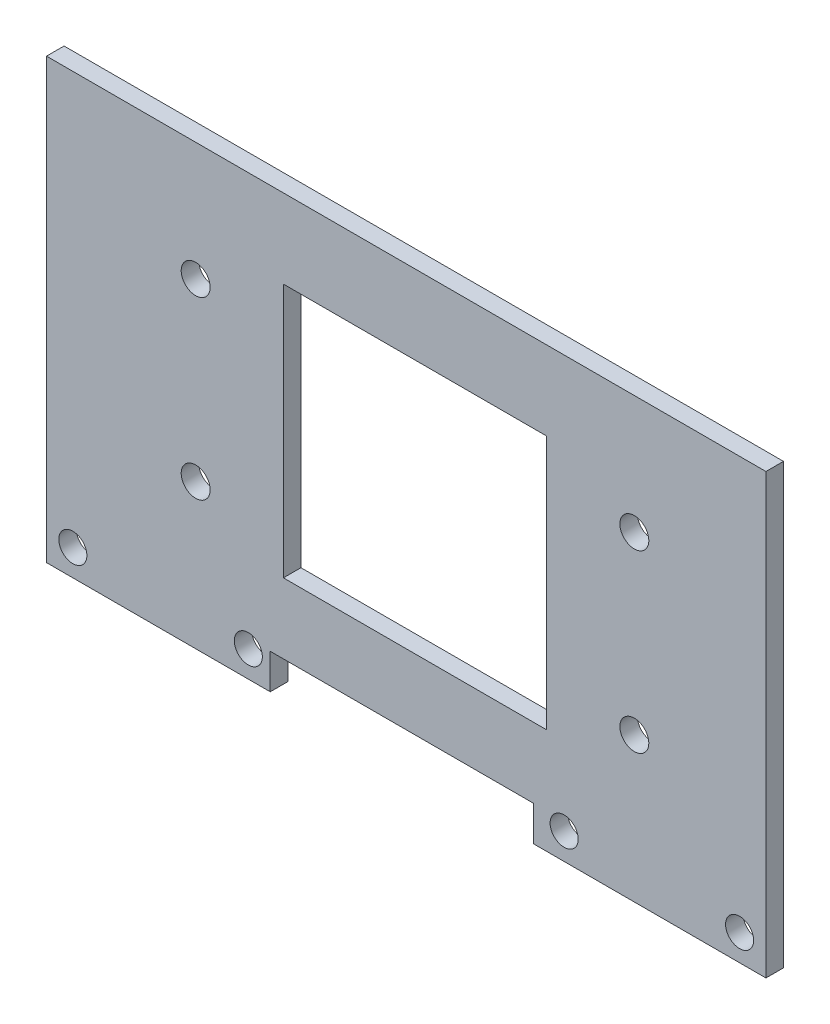
ISO-10303-21;
HEADER;
FILE_DESCRIPTION(('STEP AP214'),'2;1');
FILE_NAME('part.step','',(''),(''),'','','');
FILE_SCHEMA(('AUTOMOTIVE_DESIGN { 1 0 10303 214 1 1 1 1 }'));
ENDSEC;
DATA;
#1=APPLICATION_CONTEXT('core data for automotive mechanical design processes');
#2=APPLICATION_PROTOCOL_DEFINITION('international standard','automotive_design',2000,#1);
#3=PRODUCT_CONTEXT('',#1,'mechanical');
#4=PRODUCT('Part','Part','',(#3));
#5=PRODUCT_RELATED_PRODUCT_CATEGORY('part','',(#4));
#6=PRODUCT_DEFINITION_FORMATION('','',#4);
#7=PRODUCT_DEFINITION_CONTEXT('part definition',#1,'design');
#8=PRODUCT_DEFINITION('design','',#6,#7);
#9=PRODUCT_DEFINITION_SHAPE('','',#8);
#10=(LENGTH_UNIT() NAMED_UNIT(*) SI_UNIT(.MILLI.,.METRE.));
#11=(NAMED_UNIT(*) PLANE_ANGLE_UNIT() SI_UNIT($,.RADIAN.));
#12=(NAMED_UNIT(*) SI_UNIT($,.STERADIAN.) SOLID_ANGLE_UNIT());
#13=UNCERTAINTY_MEASURE_WITH_UNIT(LENGTH_MEASURE(1.E-05),#10,'distance_accuracy_value','');
#14=(GEOMETRIC_REPRESENTATION_CONTEXT(3) GLOBAL_UNCERTAINTY_ASSIGNED_CONTEXT((#13)) GLOBAL_UNIT_ASSIGNED_CONTEXT((#10,
#11,#12)) REPRESENTATION_CONTEXT('',''));
#15=CARTESIAN_POINT('',(0.,0.,0.));
#16=DIRECTION('',(0.,0.,1.));
#17=DIRECTION('',(1.,0.,0.));
#18=AXIS2_PLACEMENT_3D('',#15,#16,#17);
#19=CARTESIAN_POINT('',(-40.,-25.,2.));
#20=DIRECTION('',(0.,1.,0.));
#21=DIRECTION('',(-1.,0.,0.));
#22=AXIS2_PLACEMENT_3D('',#19,#20,#21);
#23=PLANE('',#22);
#24=DIRECTION('',(1.,0.,0.));
#25=VECTOR('',#24,1.);
#26=CARTESIAN_POINT('',(-40.,-25.,0.));
#27=LINE('',#26,#25);
#28=CARTESIAN_POINT('',(-42.,-25.,0.));
#29=VERTEX_POINT('',#28);
#30=CARTESIAN_POINT('',(-16.5,-25.,0.));
#31=VERTEX_POINT('',#30);
#32=EDGE_CURVE('E142',#29,#31,#27,.T.);
#33=ORIENTED_EDGE('',*,*,#32,.T.);
#34=DIRECTION('',(0.,0.,1.));
#35=VECTOR('',#34,1.);
#36=CARTESIAN_POINT('',(-16.5,-25.,0.));
#37=LINE('',#36,#35);
#38=CARTESIAN_POINT('',(-16.5,-25.,2.));
#39=VERTEX_POINT('',#38);
#40=EDGE_CURVE('E195',#31,#39,#37,.T.);
#41=ORIENTED_EDGE('',*,*,#40,.T.);
#42=DIRECTION('',(1.,0.,0.));
#43=VECTOR('',#42,1.);
#44=CARTESIAN_POINT('',(-40.,-25.,2.));
#45=LINE('',#44,#43);
#46=CARTESIAN_POINT('',(-42.,-25.,2.));
#47=VERTEX_POINT('',#46);
#48=EDGE_CURVE('E174',#47,#39,#45,.T.);
#49=ORIENTED_EDGE('',*,*,#48,.F.);
#50=DIRECTION('',(0.,0.,1.));
#51=VECTOR('',#50,1.);
#52=CARTESIAN_POINT('',(-42.,-25.,0.));
#53=LINE('',#52,#51);
#54=EDGE_CURVE('E240',#29,#47,#53,.T.);
#55=ORIENTED_EDGE('',*,*,#54,.F.);
#56=EDGE_LOOP('',(#33,#41,#49,#55));
#57=FACE_BOUND('',#56,.T.);
#58=ADVANCED_FACE('F44',(#57),#23,.F.);
#59=CARTESIAN_POINT('',(0.,0.,2.));
#60=DIRECTION('',(0.,0.,1.));
#61=DIRECTION('',(1.,0.,0.));
#62=AXIS2_PLACEMENT_3D('',#59,#60,#61);
#63=PLANE('',#62);
#64=CARTESIAN_POINT('',(25.,11.5,2.));
#65=DIRECTION('',(0.,0.,1.));
#66=DIRECTION('',(-1.,0.,0.));
#67=AXIS2_PLACEMENT_3D('',#64,#65,#66);
#68=CIRCLE('',#67,1.65);
#69=CARTESIAN_POINT('',(23.35,11.5,2.));
#70=VERTEX_POINT('',#69);
#71=EDGE_CURVE('E567',#70,#70,#68,.T.);
#72=ORIENTED_EDGE('',*,*,#71,.F.);
#73=EDGE_LOOP('',(#72));
#74=FACE_BOUND('',#73,.T.);
#75=CARTESIAN_POINT('',(-25.,-8.5,2.));
#76=DIRECTION('',(0.,0.,1.));
#77=DIRECTION('',(-1.,0.,0.));
#78=AXIS2_PLACEMENT_3D('',#75,#76,#77);
#79=CIRCLE('',#78,1.65);
#80=CARTESIAN_POINT('',(-26.65,-8.5,2.));
#81=VERTEX_POINT('',#80);
#82=EDGE_CURVE('E570',#81,#81,#79,.T.);
#83=ORIENTED_EDGE('',*,*,#82,.F.);
#84=EDGE_LOOP('',(#83));
#85=FACE_BOUND('',#84,.T.);
#86=CARTESIAN_POINT('',(25.,-8.49999999999999,2.));
#87=DIRECTION('',(0.,0.,1.));
#88=DIRECTION('',(1.,0.,0.));
#89=AXIS2_PLACEMENT_3D('',#86,#87,#88);
#90=CIRCLE('',#89,1.65);
#91=CARTESIAN_POINT('',(26.65,-8.49999999999999,2.));
#92=VERTEX_POINT('',#91);
#93=EDGE_CURVE('E585',#92,#92,#90,.T.);
#94=ORIENTED_EDGE('',*,*,#93,.F.);
#95=EDGE_LOOP('',(#94));
#96=FACE_BOUND('',#95,.T.);
#97=CARTESIAN_POINT('',(-25.,11.5,2.));
#98=DIRECTION('',(0.,0.,1.));
#99=DIRECTION('',(1.,0.,0.));
#100=AXIS2_PLACEMENT_3D('',#97,#98,#99);
#101=CIRCLE('',#100,1.65);
#102=CARTESIAN_POINT('',(-23.35,11.5,2.));
#103=VERTEX_POINT('',#102);
#104=EDGE_CURVE('E161',#103,#103,#101,.T.);
#105=ORIENTED_EDGE('',*,*,#104,.F.);
#106=EDGE_LOOP('',(#105));
#107=FACE_BOUND('',#106,.T.);
#108=DIRECTION('',(-1.,0.,0.));
#109=VECTOR('',#108,1.);
#110=CARTESIAN_POINT('',(-15.,-21.,2.));
#111=LINE('',#110,#109);
#112=CARTESIAN_POINT('',(13.5,-21.,2.));
#113=VERTEX_POINT('',#112);
#114=CARTESIAN_POINT('',(-16.5,-21.,2.));
#115=VERTEX_POINT('',#114);
#116=EDGE_CURVE('E204',#113,#115,#111,.T.);
#117=ORIENTED_EDGE('',*,*,#116,.F.);
#118=DIRECTION('',(0.,-1.,0.));
#119=VECTOR('',#118,1.);
#120=CARTESIAN_POINT('',(13.5,-25.,2.));
#121=LINE('',#120,#119);
#122=CARTESIAN_POINT('',(13.5,-25.,2.));
#123=VERTEX_POINT('',#122);
#124=EDGE_CURVE('E155',#113,#123,#121,.T.);
#125=ORIENTED_EDGE('',*,*,#124,.T.);
#126=CARTESIAN_POINT('',(40.,-25.,2.));
#127=VERTEX_POINT('',#126);
#128=EDGE_CURVE('E148',#123,#127,#45,.T.);
#129=ORIENTED_EDGE('',*,*,#128,.T.);
#130=DIRECTION('',(0.,1.,0.));
#131=VECTOR('',#130,1.);
#132=CARTESIAN_POINT('',(40.,25.,2.));
#133=LINE('',#132,#131);
#134=CARTESIAN_POINT('',(40.,25.,2.));
#135=VERTEX_POINT('',#134);
#136=EDGE_CURVE('E278',#127,#135,#133,.T.);
#137=ORIENTED_EDGE('',*,*,#136,.T.);
#138=DIRECTION('',(-1.,0.,0.));
#139=VECTOR('',#138,1.);
#140=CARTESIAN_POINT('',(-40.,25.,2.));
#141=LINE('',#140,#139);
#142=CARTESIAN_POINT('',(-42.,25.,2.));
#143=VERTEX_POINT('',#142);
#144=EDGE_CURVE('E179',#135,#143,#141,.T.);
#145=ORIENTED_EDGE('',*,*,#144,.T.);
#146=DIRECTION('',(0.,-1.,0.));
#147=VECTOR('',#146,1.);
#148=CARTESIAN_POINT('',(-42.,25.,2.));
#149=LINE('',#148,#147);
#150=EDGE_CURVE('E231',#143,#47,#149,.T.);
#151=ORIENTED_EDGE('',*,*,#150,.T.);
#152=ORIENTED_EDGE('',*,*,#48,.T.);
#153=DIRECTION('',(0.,-1.,0.));
#154=VECTOR('',#153,1.);
#155=CARTESIAN_POINT('',(-16.5,-25.,2.));
#156=LINE('',#155,#154);
#157=EDGE_CURVE('E152',#115,#39,#156,.T.);
#158=ORIENTED_EDGE('',*,*,#157,.F.);
#159=EDGE_LOOP('',(#117,#125,#129,#137,#145,#151,#152,#158));
#160=FACE_BOUND('',#159,.T.);
#161=CARTESIAN_POINT('',(-39.,-22.,2.));
#162=DIRECTION('',(0.,0.,1.));
#163=DIRECTION('',(1.,0.,0.));
#164=AXIS2_PLACEMENT_3D('',#161,#162,#163);
#165=CIRCLE('',#164,1.6);
#166=CARTESIAN_POINT('',(-37.4,-22.,2.));
#167=VERTEX_POINT('',#166);
#168=EDGE_CURVE('E205',#167,#167,#165,.T.);
#169=ORIENTED_EDGE('',*,*,#168,.F.);
#170=EDGE_LOOP('',(#169));
#171=FACE_BOUND('',#170,.T.);
#172=CARTESIAN_POINT('',(-19.,-22.,2.));
#173=DIRECTION('',(0.,0.,1.));
#174=DIRECTION('',(1.,0.,0.));
#175=AXIS2_PLACEMENT_3D('',#172,#173,#174);
#176=CIRCLE('',#175,1.6);
#177=CARTESIAN_POINT('',(-17.4,-22.,2.));
#178=VERTEX_POINT('',#177);
#179=EDGE_CURVE('E209',#178,#178,#176,.T.);
#180=ORIENTED_EDGE('',*,*,#179,.F.);
#181=EDGE_LOOP('',(#180));
#182=FACE_BOUND('',#181,.T.);
#183=CARTESIAN_POINT('',(17.,-22.,2.));
#184=DIRECTION('',(0.,0.,1.));
#185=DIRECTION('',(-1.,0.,0.));
#186=AXIS2_PLACEMENT_3D('',#183,#184,#185);
#187=CIRCLE('',#186,1.6);
#188=CARTESIAN_POINT('',(15.4,-22.,2.));
#189=VERTEX_POINT('',#188);
#190=EDGE_CURVE('E219',#189,#189,#187,.T.);
#191=ORIENTED_EDGE('',*,*,#190,.F.);
#192=EDGE_LOOP('',(#191));
#193=FACE_BOUND('',#192,.T.);
#194=CARTESIAN_POINT('',(37.,-22.,2.));
#195=DIRECTION('',(0.,0.,1.));
#196=DIRECTION('',(-1.,0.,0.));
#197=AXIS2_PLACEMENT_3D('',#194,#195,#196);
#198=CIRCLE('',#197,1.6);
#199=CARTESIAN_POINT('',(35.4,-22.,2.));
#200=VERTEX_POINT('',#199);
#201=EDGE_CURVE('E225',#200,#200,#198,.T.);
#202=ORIENTED_EDGE('',*,*,#201,.F.);
#203=EDGE_LOOP('',(#202));
#204=FACE_BOUND('',#203,.T.);
#205=DIRECTION('',(1.,0.,0.));
#206=VECTOR('',#205,1.);
#207=CARTESIAN_POINT('',(-15.,-13.,2.));
#208=LINE('',#207,#206);
#209=CARTESIAN_POINT('',(-15.,-13.,2.));
#210=VERTEX_POINT('',#209);
#211=CARTESIAN_POINT('',(15.,-13.,2.));
#212=VERTEX_POINT('',#211);
#213=EDGE_CURVE('E249',#210,#212,#208,.T.);
#214=ORIENTED_EDGE('',*,*,#213,.F.);
#215=DIRECTION('',(0.,-1.,0.));
#216=VECTOR('',#215,1.);
#217=CARTESIAN_POINT('',(-15.,16.,2.));
#218=LINE('',#217,#216);
#219=CARTESIAN_POINT('',(-15.,16.,2.));
#220=VERTEX_POINT('',#219);
#221=EDGE_CURVE('E246',#220,#210,#218,.T.);
#222=ORIENTED_EDGE('',*,*,#221,.F.);
#223=DIRECTION('',(-1.,0.,0.));
#224=VECTOR('',#223,1.);
#225=CARTESIAN_POINT('',(-15.,16.,2.));
#226=LINE('',#225,#224);
#227=CARTESIAN_POINT('',(15.,16.,2.));
#228=VERTEX_POINT('',#227);
#229=EDGE_CURVE('E254',#228,#220,#226,.T.);
#230=ORIENTED_EDGE('',*,*,#229,.F.);
#231=DIRECTION('',(0.,1.,0.));
#232=VECTOR('',#231,1.);
#233=CARTESIAN_POINT('',(15.,16.,2.));
#234=LINE('',#233,#232);
#235=EDGE_CURVE('E258',#212,#228,#234,.T.);
#236=ORIENTED_EDGE('',*,*,#235,.F.);
#237=EDGE_LOOP('',(#214,#222,#230,#236));
#238=FACE_BOUND('',#237,.T.);
#239=ADVANCED_FACE('F292',(#74,#85,#96,#107,#160,#171,#182,#193,#204,#238),#63,.T.);
#240=CARTESIAN_POINT('',(0.,0.,0.));
#241=DIRECTION('',(0.,0.,1.));
#242=DIRECTION('',(1.,0.,0.));
#243=AXIS2_PLACEMENT_3D('',#240,#241,#242);
#244=PLANE('',#243);
#245=CARTESIAN_POINT('',(25.,11.5,0.));
#246=DIRECTION('',(0.,0.,1.));
#247=DIRECTION('',(-1.,0.,0.));
#248=AXIS2_PLACEMENT_3D('',#245,#246,#247);
#249=CIRCLE('',#248,1.65);
#250=CARTESIAN_POINT('',(23.35,11.5,0.));
#251=VERTEX_POINT('',#250);
#252=EDGE_CURVE('E564',#251,#251,#249,.T.);
#253=ORIENTED_EDGE('',*,*,#252,.T.);
#254=EDGE_LOOP('',(#253));
#255=FACE_BOUND('',#254,.T.);
#256=CARTESIAN_POINT('',(-25.,-8.5,0.));
#257=DIRECTION('',(0.,0.,1.));
#258=DIRECTION('',(-1.,0.,0.));
#259=AXIS2_PLACEMENT_3D('',#256,#257,#258);
#260=CIRCLE('',#259,1.65);
#261=CARTESIAN_POINT('',(-26.65,-8.5,0.));
#262=VERTEX_POINT('',#261);
#263=EDGE_CURVE('E583',#262,#262,#260,.T.);
#264=ORIENTED_EDGE('',*,*,#263,.T.);
#265=EDGE_LOOP('',(#264));
#266=FACE_BOUND('',#265,.T.);
#267=CARTESIAN_POINT('',(25.,-8.49999999999999,0.));
#268=DIRECTION('',(0.,0.,1.));
#269=DIRECTION('',(1.,0.,0.));
#270=AXIS2_PLACEMENT_3D('',#267,#268,#269);
#271=CIRCLE('',#270,1.65);
#272=CARTESIAN_POINT('',(26.65,-8.49999999999999,0.));
#273=VERTEX_POINT('',#272);
#274=EDGE_CURVE('E574',#273,#273,#271,.T.);
#275=ORIENTED_EDGE('',*,*,#274,.T.);
#276=EDGE_LOOP('',(#275));
#277=FACE_BOUND('',#276,.T.);
#278=CARTESIAN_POINT('',(-25.,11.5,0.));
#279=DIRECTION('',(0.,0.,1.));
#280=DIRECTION('',(1.,0.,0.));
#281=AXIS2_PLACEMENT_3D('',#278,#279,#280);
#282=CIRCLE('',#281,1.65);
#283=CARTESIAN_POINT('',(-23.35,11.5,0.));
#284=VERTEX_POINT('',#283);
#285=EDGE_CURVE('E158',#284,#284,#282,.T.);
#286=ORIENTED_EDGE('',*,*,#285,.T.);
#287=EDGE_LOOP('',(#286));
#288=FACE_BOUND('',#287,.T.);
#289=DIRECTION('',(0.,-1.,0.));
#290=VECTOR('',#289,1.);
#291=CARTESIAN_POINT('',(13.5,-25.,0.));
#292=LINE('',#291,#290);
#293=CARTESIAN_POINT('',(13.5,-21.,0.));
#294=VERTEX_POINT('',#293);
#295=CARTESIAN_POINT('',(13.5,-25.,0.));
#296=VERTEX_POINT('',#295);
#297=EDGE_CURVE('E136',#294,#296,#292,.T.);
#298=ORIENTED_EDGE('',*,*,#297,.F.);
#299=DIRECTION('',(-1.,0.,0.));
#300=VECTOR('',#299,1.);
#301=CARTESIAN_POINT('',(-15.,-21.,0.));
#302=LINE('',#301,#300);
#303=CARTESIAN_POINT('',(-16.5,-21.,0.));
#304=VERTEX_POINT('',#303);
#305=EDGE_CURVE('E59',#294,#304,#302,.T.);
#306=ORIENTED_EDGE('',*,*,#305,.T.);
#307=DIRECTION('',(0.,-1.,0.));
#308=VECTOR('',#307,1.);
#309=CARTESIAN_POINT('',(-16.5,-25.,0.));
#310=LINE('',#309,#308);
#311=EDGE_CURVE('E194',#304,#31,#310,.T.);
#312=ORIENTED_EDGE('',*,*,#311,.T.);
#313=ORIENTED_EDGE('',*,*,#32,.F.);
#314=DIRECTION('',(0.,-1.,0.));
#315=VECTOR('',#314,1.);
#316=CARTESIAN_POINT('',(-42.,25.,0.));
#317=LINE('',#316,#315);
#318=CARTESIAN_POINT('',(-42.,25.,0.));
#319=VERTEX_POINT('',#318);
#320=EDGE_CURVE('E234',#319,#29,#317,.T.);
#321=ORIENTED_EDGE('',*,*,#320,.F.);
#322=DIRECTION('',(-1.,0.,0.));
#323=VECTOR('',#322,1.);
#324=CARTESIAN_POINT('',(-40.,25.,0.));
#325=LINE('',#324,#323);
#326=CARTESIAN_POINT('',(40.,25.,0.));
#327=VERTEX_POINT('',#326);
#328=EDGE_CURVE('E143',#327,#319,#325,.T.);
#329=ORIENTED_EDGE('',*,*,#328,.F.);
#330=DIRECTION('',(0.,1.,0.));
#331=VECTOR('',#330,1.);
#332=CARTESIAN_POINT('',(40.,25.,0.));
#333=LINE('',#332,#331);
#334=CARTESIAN_POINT('',(40.,-25.,0.));
#335=VERTEX_POINT('',#334);
#336=EDGE_CURVE('E138',#335,#327,#333,.T.);
#337=ORIENTED_EDGE('',*,*,#336,.F.);
#338=EDGE_CURVE('E131',#296,#335,#27,.T.);
#339=ORIENTED_EDGE('',*,*,#338,.F.);
#340=EDGE_LOOP('',(#298,#306,#312,#313,#321,#329,#337,#339));
#341=FACE_BOUND('',#340,.T.);
#342=CARTESIAN_POINT('',(-39.,-22.,0.));
#343=DIRECTION('',(0.,0.,1.));
#344=DIRECTION('',(1.,0.,0.));
#345=AXIS2_PLACEMENT_3D('',#342,#343,#344);
#346=CIRCLE('',#345,1.6);
#347=CARTESIAN_POINT('',(-37.4,-22.,0.));
#348=VERTEX_POINT('',#347);
#349=EDGE_CURVE('E202',#348,#348,#346,.T.);
#350=ORIENTED_EDGE('',*,*,#349,.T.);
#351=EDGE_LOOP('',(#350));
#352=FACE_BOUND('',#351,.T.);
#353=CARTESIAN_POINT('',(-19.,-22.,0.));
#354=DIRECTION('',(0.,0.,1.));
#355=DIRECTION('',(1.,0.,0.));
#356=AXIS2_PLACEMENT_3D('',#353,#354,#355);
#357=CIRCLE('',#356,1.6);
#358=CARTESIAN_POINT('',(-17.4,-22.,0.));
#359=VERTEX_POINT('',#358);
#360=EDGE_CURVE('E213',#359,#359,#357,.T.);
#361=ORIENTED_EDGE('',*,*,#360,.T.);
#362=EDGE_LOOP('',(#361));
#363=FACE_BOUND('',#362,.T.);
#364=CARTESIAN_POINT('',(17.,-22.,0.));
#365=DIRECTION('',(0.,0.,1.));
#366=DIRECTION('',(-1.,0.,0.));
#367=AXIS2_PLACEMENT_3D('',#364,#365,#366);
#368=CIRCLE('',#367,1.6);
#369=CARTESIAN_POINT('',(15.4,-22.,0.));
#370=VERTEX_POINT('',#369);
#371=EDGE_CURVE('E223',#370,#370,#368,.T.);
#372=ORIENTED_EDGE('',*,*,#371,.T.);
#373=EDGE_LOOP('',(#372));
#374=FACE_BOUND('',#373,.T.);
#375=CARTESIAN_POINT('',(37.,-22.,0.));
#376=DIRECTION('',(0.,0.,1.));
#377=DIRECTION('',(-1.,0.,0.));
#378=AXIS2_PLACEMENT_3D('',#375,#376,#377);
#379=CIRCLE('',#378,1.6);
#380=CARTESIAN_POINT('',(35.4,-22.,0.));
#381=VERTEX_POINT('',#380);
#382=EDGE_CURVE('E198',#381,#381,#379,.T.);
#383=ORIENTED_EDGE('',*,*,#382,.T.);
#384=EDGE_LOOP('',(#383));
#385=FACE_BOUND('',#384,.T.);
#386=DIRECTION('',(0.,-1.,0.));
#387=VECTOR('',#386,1.);
#388=CARTESIAN_POINT('',(-15.,16.,0.));
#389=LINE('',#388,#387);
#390=CARTESIAN_POINT('',(-15.,16.,0.));
#391=VERTEX_POINT('',#390);
#392=CARTESIAN_POINT('',(-15.,-13.,0.));
#393=VERTEX_POINT('',#392);
#394=EDGE_CURVE('E243',#391,#393,#389,.T.);
#395=ORIENTED_EDGE('',*,*,#394,.T.);
#396=DIRECTION('',(1.,0.,0.));
#397=VECTOR('',#396,1.);
#398=CARTESIAN_POINT('',(-15.,-13.,0.));
#399=LINE('',#398,#397);
#400=CARTESIAN_POINT('',(15.,-13.,0.));
#401=VERTEX_POINT('',#400);
#402=EDGE_CURVE('E262',#393,#401,#399,.T.);
#403=ORIENTED_EDGE('',*,*,#402,.T.);
#404=DIRECTION('',(0.,1.,0.));
#405=VECTOR('',#404,1.);
#406=CARTESIAN_POINT('',(15.,16.,0.));
#407=LINE('',#406,#405);
#408=CARTESIAN_POINT('',(15.,16.,0.));
#409=VERTEX_POINT('',#408);
#410=EDGE_CURVE('E265',#401,#409,#407,.T.);
#411=ORIENTED_EDGE('',*,*,#410,.T.);
#412=DIRECTION('',(-1.,0.,0.));
#413=VECTOR('',#412,1.);
#414=CARTESIAN_POINT('',(-15.,16.,0.));
#415=LINE('',#414,#413);
#416=EDGE_CURVE('E250',#409,#391,#415,.T.);
#417=ORIENTED_EDGE('',*,*,#416,.T.);
#418=EDGE_LOOP('',(#395,#403,#411,#417));
#419=FACE_BOUND('',#418,.T.);
#420=ADVANCED_FACE('F133',(#255,#266,#277,#288,#341,#352,#363,#374,#385,#419),#244,.F.);
#421=CARTESIAN_POINT('',(40.,25.,2.));
#422=DIRECTION('',(-1.,0.,0.));
#423=DIRECTION('',(0.,-1.,0.));
#424=AXIS2_PLACEMENT_3D('',#421,#422,#423);
#425=PLANE('',#424);
#426=ORIENTED_EDGE('',*,*,#336,.T.);
#427=DIRECTION('',(0.,0.,-1.));
#428=VECTOR('',#427,1.);
#429=CARTESIAN_POINT('',(40.,25.,2.));
#430=LINE('',#429,#428);
#431=EDGE_CURVE('E12',#135,#327,#430,.T.);
#432=ORIENTED_EDGE('',*,*,#431,.F.);
#433=ORIENTED_EDGE('',*,*,#136,.F.);
#434=DIRECTION('',(0.,0.,-1.));
#435=VECTOR('',#434,1.);
#436=CARTESIAN_POINT('',(40.,-25.,2.));
#437=LINE('',#436,#435);
#438=EDGE_CURVE('E52',#127,#335,#437,.T.);
#439=ORIENTED_EDGE('',*,*,#438,.T.);
#440=EDGE_LOOP('',(#426,#432,#433,#439));
#441=FACE_BOUND('',#440,.T.);
#442=ADVANCED_FACE('F46',(#441),#425,.F.);
#443=CARTESIAN_POINT('',(-40.,25.,2.));
#444=DIRECTION('',(0.,-1.,0.));
#445=DIRECTION('',(0.,0.,-1.));
#446=AXIS2_PLACEMENT_3D('',#443,#444,#445);
#447=PLANE('',#446);
#448=ORIENTED_EDGE('',*,*,#328,.T.);
#449=DIRECTION('',(0.,0.,1.));
#450=VECTOR('',#449,1.);
#451=CARTESIAN_POINT('',(-42.,25.,0.));
#452=LINE('',#451,#450);
#453=EDGE_CURVE('E236',#319,#143,#452,.T.);
#454=ORIENTED_EDGE('',*,*,#453,.T.);
#455=ORIENTED_EDGE('',*,*,#144,.F.);
#456=ORIENTED_EDGE('',*,*,#431,.T.);
#457=EDGE_LOOP('',(#448,#454,#455,#456));
#458=FACE_BOUND('',#457,.T.);
#459=ADVANCED_FACE('F289',(#458),#447,.F.);
#460=ORIENTED_EDGE('',*,*,#128,.F.);
#461=DIRECTION('',(0.,0.,1.));
#462=VECTOR('',#461,1.);
#463=CARTESIAN_POINT('',(13.5,-25.,0.));
#464=LINE('',#463,#462);
#465=EDGE_CURVE('E146',#296,#123,#464,.T.);
#466=ORIENTED_EDGE('',*,*,#465,.F.);
#467=ORIENTED_EDGE('',*,*,#338,.T.);
#468=ORIENTED_EDGE('',*,*,#438,.F.);
#469=EDGE_LOOP('',(#460,#466,#467,#468));
#470=FACE_BOUND('',#469,.T.);
#471=ADVANCED_FACE('F147',(#470),#23,.F.);
#472=CARTESIAN_POINT('',(-15.,16.,2.));
#473=DIRECTION('',(1.,0.,0.));
#474=DIRECTION('',(0.,1.,0.));
#475=AXIS2_PLACEMENT_3D('',#472,#473,#474);
#476=PLANE('',#475);
#477=ORIENTED_EDGE('',*,*,#394,.F.);
#478=DIRECTION('',(0.,0.,-1.));
#479=VECTOR('',#478,1.);
#480=CARTESIAN_POINT('',(-15.,16.,2.));
#481=LINE('',#480,#479);
#482=EDGE_CURVE('E257',#220,#391,#481,.T.);
#483=ORIENTED_EDGE('',*,*,#482,.F.);
#484=ORIENTED_EDGE('',*,*,#221,.T.);
#485=DIRECTION('',(0.,0.,-1.));
#486=VECTOR('',#485,1.);
#487=CARTESIAN_POINT('',(-15.,-13.,2.));
#488=LINE('',#487,#486);
#489=EDGE_CURVE('E276',#210,#393,#488,.T.);
#490=ORIENTED_EDGE('',*,*,#489,.T.);
#491=EDGE_LOOP('',(#477,#483,#484,#490));
#492=FACE_BOUND('',#491,.T.);
#493=ADVANCED_FACE('F327',(#492),#476,.T.);
#494=CARTESIAN_POINT('',(-15.,-13.,2.));
#495=DIRECTION('',(0.,1.,0.));
#496=DIRECTION('',(0.,0.,1.));
#497=AXIS2_PLACEMENT_3D('',#494,#495,#496);
#498=PLANE('',#497);
#499=ORIENTED_EDGE('',*,*,#402,.F.);
#500=ORIENTED_EDGE('',*,*,#489,.F.);
#501=ORIENTED_EDGE('',*,*,#213,.T.);
#502=DIRECTION('',(0.,0.,-1.));
#503=VECTOR('',#502,1.);
#504=CARTESIAN_POINT('',(15.,-13.,2.));
#505=LINE('',#504,#503);
#506=EDGE_CURVE('E274',#212,#401,#505,.T.);
#507=ORIENTED_EDGE('',*,*,#506,.T.);
#508=EDGE_LOOP('',(#499,#500,#501,#507));
#509=FACE_BOUND('',#508,.T.);
#510=ADVANCED_FACE('F331',(#509),#498,.T.);
#511=CARTESIAN_POINT('',(15.,16.,2.));
#512=DIRECTION('',(-1.,0.,0.));
#513=DIRECTION('',(0.,-1.,0.));
#514=AXIS2_PLACEMENT_3D('',#511,#512,#513);
#515=PLANE('',#514);
#516=ORIENTED_EDGE('',*,*,#410,.F.);
#517=ORIENTED_EDGE('',*,*,#506,.F.);
#518=ORIENTED_EDGE('',*,*,#235,.T.);
#519=DIRECTION('',(0.,0.,-1.));
#520=VECTOR('',#519,1.);
#521=CARTESIAN_POINT('',(15.,16.,2.));
#522=LINE('',#521,#520);
#523=EDGE_CURVE('E272',#228,#409,#522,.T.);
#524=ORIENTED_EDGE('',*,*,#523,.T.);
#525=EDGE_LOOP('',(#516,#517,#518,#524));
#526=FACE_BOUND('',#525,.T.);
#527=ADVANCED_FACE('F351',(#526),#515,.T.);
#528=CARTESIAN_POINT('',(-15.,16.,2.));
#529=DIRECTION('',(0.,-1.,0.));
#530=DIRECTION('',(0.,0.,-1.));
#531=AXIS2_PLACEMENT_3D('',#528,#529,#530);
#532=PLANE('',#531);
#533=ORIENTED_EDGE('',*,*,#416,.F.);
#534=ORIENTED_EDGE('',*,*,#523,.F.);
#535=ORIENTED_EDGE('',*,*,#229,.T.);
#536=ORIENTED_EDGE('',*,*,#482,.T.);
#537=EDGE_LOOP('',(#533,#534,#535,#536));
#538=FACE_BOUND('',#537,.T.);
#539=ADVANCED_FACE('F315',(#538),#532,.T.);
#540=CARTESIAN_POINT('',(-42.,25.,0.));
#541=DIRECTION('',(-1.,0.,0.));
#542=DIRECTION('',(0.,0.,1.));
#543=AXIS2_PLACEMENT_3D('',#540,#541,#542);
#544=PLANE('',#543);
#545=ORIENTED_EDGE('',*,*,#150,.F.);
#546=ORIENTED_EDGE('',*,*,#453,.F.);
#547=ORIENTED_EDGE('',*,*,#320,.T.);
#548=ORIENTED_EDGE('',*,*,#54,.T.);
#549=EDGE_LOOP('',(#545,#546,#547,#548));
#550=FACE_BOUND('',#549,.T.);
#551=ADVANCED_FACE('F296',(#550),#544,.T.);
#552=CARTESIAN_POINT('',(-15.,-21.,0.));
#553=DIRECTION('',(0.,1.,0.));
#554=DIRECTION('',(-1.,0.,0.));
#555=AXIS2_PLACEMENT_3D('',#552,#553,#554);
#556=PLANE('',#555);
#557=ORIENTED_EDGE('',*,*,#305,.F.);
#558=DIRECTION('',(0.,0.,1.));
#559=VECTOR('',#558,1.);
#560=CARTESIAN_POINT('',(13.5,-21.,0.));
#561=LINE('',#560,#559);
#562=EDGE_CURVE('E63',#294,#113,#561,.T.);
#563=ORIENTED_EDGE('',*,*,#562,.T.);
#564=ORIENTED_EDGE('',*,*,#116,.T.);
#565=DIRECTION('',(0.,0.,1.));
#566=VECTOR('',#565,1.);
#567=CARTESIAN_POINT('',(-16.5,-21.,0.));
#568=LINE('',#567,#566);
#569=EDGE_CURVE('E199',#304,#115,#568,.T.);
#570=ORIENTED_EDGE('',*,*,#569,.F.);
#571=EDGE_LOOP('',(#557,#563,#564,#570));
#572=FACE_BOUND('',#571,.T.);
#573=ADVANCED_FACE('F302',(#572),#556,.F.);
#574=CARTESIAN_POINT('',(37.,-22.,0.));
#575=DIRECTION('',(0.,0.,1.));
#576=DIRECTION('',(1.,0.,0.));
#577=AXIS2_PLACEMENT_3D('',#574,#575,#576);
#578=CYLINDRICAL_SURFACE('',#577,1.6);
#579=ORIENTED_EDGE('',*,*,#382,.F.);
#580=EDGE_LOOP('',(#579));
#581=FACE_BOUND('',#580,.T.);
#582=ORIENTED_EDGE('',*,*,#201,.T.);
#583=EDGE_LOOP('',(#582));
#584=FACE_BOUND('',#583,.T.);
#585=ADVANCED_FACE('F304',(#581,#584),#578,.F.);
#586=CARTESIAN_POINT('',(17.,-22.,0.));
#587=DIRECTION('',(0.,0.,1.));
#588=DIRECTION('',(1.,0.,0.));
#589=AXIS2_PLACEMENT_3D('',#586,#587,#588);
#590=CYLINDRICAL_SURFACE('',#589,1.6);
#591=ORIENTED_EDGE('',*,*,#371,.F.);
#592=EDGE_LOOP('',(#591));
#593=FACE_BOUND('',#592,.T.);
#594=ORIENTED_EDGE('',*,*,#190,.T.);
#595=EDGE_LOOP('',(#594));
#596=FACE_BOUND('',#595,.T.);
#597=ADVANCED_FACE('F311',(#593,#596),#590,.F.);
#598=CARTESIAN_POINT('',(-19.,-22.,0.));
#599=DIRECTION('',(0.,0.,1.));
#600=DIRECTION('',(1.,0.,0.));
#601=AXIS2_PLACEMENT_3D('',#598,#599,#600);
#602=CYLINDRICAL_SURFACE('',#601,1.6);
#603=ORIENTED_EDGE('',*,*,#360,.F.);
#604=EDGE_LOOP('',(#603));
#605=FACE_BOUND('',#604,.T.);
#606=ORIENTED_EDGE('',*,*,#179,.T.);
#607=EDGE_LOOP('',(#606));
#608=FACE_BOUND('',#607,.T.);
#609=ADVANCED_FACE('F490',(#605,#608),#602,.F.);
#610=CARTESIAN_POINT('',(-39.,-22.,0.));
#611=DIRECTION('',(0.,0.,1.));
#612=DIRECTION('',(1.,0.,0.));
#613=AXIS2_PLACEMENT_3D('',#610,#611,#612);
#614=CYLINDRICAL_SURFACE('',#613,1.6);
#615=ORIENTED_EDGE('',*,*,#349,.F.);
#616=EDGE_LOOP('',(#615));
#617=FACE_BOUND('',#616,.T.);
#618=ORIENTED_EDGE('',*,*,#168,.T.);
#619=EDGE_LOOP('',(#618));
#620=FACE_BOUND('',#619,.T.);
#621=ADVANCED_FACE('F488',(#617,#620),#614,.F.);
#622=CARTESIAN_POINT('',(-16.5,-25.,0.));
#623=DIRECTION('',(-1.,0.,0.));
#624=DIRECTION('',(0.,0.,1.));
#625=AXIS2_PLACEMENT_3D('',#622,#623,#624);
#626=PLANE('',#625);
#627=ORIENTED_EDGE('',*,*,#157,.T.);
#628=ORIENTED_EDGE('',*,*,#40,.F.);
#629=ORIENTED_EDGE('',*,*,#311,.F.);
#630=ORIENTED_EDGE('',*,*,#569,.T.);
#631=EDGE_LOOP('',(#627,#628,#629,#630));
#632=FACE_BOUND('',#631,.T.);
#633=ADVANCED_FACE('F301',(#632),#626,.F.);
#634=CARTESIAN_POINT('',(13.5,-25.,0.));
#635=DIRECTION('',(-1.,0.,0.));
#636=DIRECTION('',(0.,0.,1.));
#637=AXIS2_PLACEMENT_3D('',#634,#635,#636);
#638=PLANE('',#637);
#639=ORIENTED_EDGE('',*,*,#124,.F.);
#640=ORIENTED_EDGE('',*,*,#562,.F.);
#641=ORIENTED_EDGE('',*,*,#297,.T.);
#642=ORIENTED_EDGE('',*,*,#465,.T.);
#643=EDGE_LOOP('',(#639,#640,#641,#642));
#644=FACE_BOUND('',#643,.T.);
#645=ADVANCED_FACE('F154',(#644),#638,.T.);
#646=CARTESIAN_POINT('',(-25.,11.5,0.));
#647=DIRECTION('',(0.,0.,1.));
#648=DIRECTION('',(1.,0.,0.));
#649=AXIS2_PLACEMENT_3D('',#646,#647,#648);
#650=CYLINDRICAL_SURFACE('',#649,1.65);
#651=ORIENTED_EDGE('',*,*,#285,.F.);
#652=EDGE_LOOP('',(#651));
#653=FACE_BOUND('',#652,.T.);
#654=ORIENTED_EDGE('',*,*,#104,.T.);
#655=EDGE_LOOP('',(#654));
#656=FACE_BOUND('',#655,.T.);
#657=ADVANCED_FACE('F443',(#653,#656),#650,.F.);
#658=CARTESIAN_POINT('',(25.,-8.49999999999999,0.));
#659=DIRECTION('',(0.,0.,1.));
#660=DIRECTION('',(1.,0.,0.));
#661=AXIS2_PLACEMENT_3D('',#658,#659,#660);
#662=CYLINDRICAL_SURFACE('',#661,1.65);
#663=ORIENTED_EDGE('',*,*,#274,.F.);
#664=EDGE_LOOP('',(#663));
#665=FACE_BOUND('',#664,.T.);
#666=ORIENTED_EDGE('',*,*,#93,.T.);
#667=EDGE_LOOP('',(#666));
#668=FACE_BOUND('',#667,.T.);
#669=ADVANCED_FACE('F451',(#665,#668),#662,.F.);
#670=CARTESIAN_POINT('',(-25.,-8.5,0.));
#671=DIRECTION('',(0.,0.,1.));
#672=DIRECTION('',(1.,0.,0.));
#673=AXIS2_PLACEMENT_3D('',#670,#671,#672);
#674=CYLINDRICAL_SURFACE('',#673,1.65);
#675=ORIENTED_EDGE('',*,*,#263,.F.);
#676=EDGE_LOOP('',(#675));
#677=FACE_BOUND('',#676,.T.);
#678=ORIENTED_EDGE('',*,*,#82,.T.);
#679=EDGE_LOOP('',(#678));
#680=FACE_BOUND('',#679,.T.);
#681=ADVANCED_FACE('F461',(#677,#680),#674,.F.);
#682=CARTESIAN_POINT('',(25.,11.5,0.));
#683=DIRECTION('',(0.,0.,1.));
#684=DIRECTION('',(1.,0.,0.));
#685=AXIS2_PLACEMENT_3D('',#682,#683,#684);
#686=CYLINDRICAL_SURFACE('',#685,1.65);
#687=ORIENTED_EDGE('',*,*,#252,.F.);
#688=EDGE_LOOP('',(#687));
#689=FACE_BOUND('',#688,.T.);
#690=ORIENTED_EDGE('',*,*,#71,.T.);
#691=EDGE_LOOP('',(#690));
#692=FACE_BOUND('',#691,.T.);
#693=ADVANCED_FACE('F471',(#689,#692),#686,.F.);
#694=CLOSED_SHELL('',(#58,#239,#420,#442,#459,#471,#493,#510,#527,#539,#551,#573,#585,#597,#609,
#621,#633,#645,#657,#669,#681,#693));
#695=MANIFOLD_SOLID_BREP('B2',#694);
#696=ADVANCED_BREP_SHAPE_REPRESENTATION('',(#18,#695),#14);
#697=SHAPE_DEFINITION_REPRESENTATION(#9,#696);
ENDSEC;
END-ISO-10303-21;
